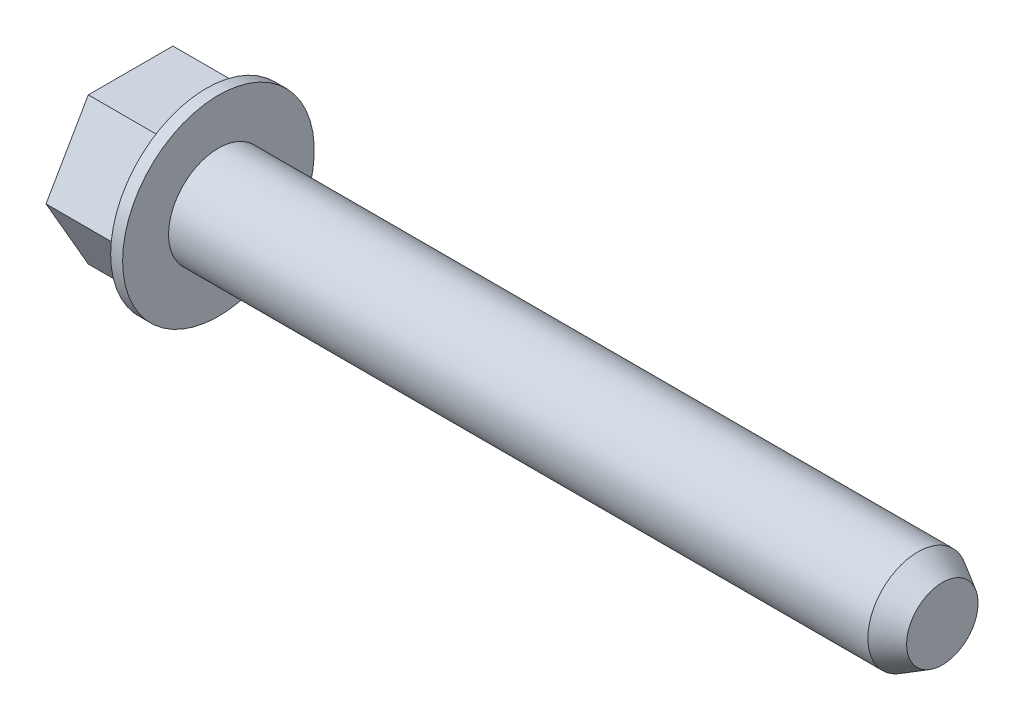
ISO-10303-21;
HEADER;
FILE_DESCRIPTION(('STEP AP214'),'2;1');
FILE_NAME('part.step','',(''),(''),'','','');
FILE_SCHEMA(('AUTOMOTIVE_DESIGN { 1 0 10303 214 1 1 1 1 }'));
ENDSEC;
DATA;
#1=APPLICATION_CONTEXT('core data for automotive mechanical design processes');
#2=APPLICATION_PROTOCOL_DEFINITION('international standard','automotive_design',2000,#1);
#3=PRODUCT_CONTEXT('',#1,'mechanical');
#4=PRODUCT('Part','Part','',(#3));
#5=PRODUCT_RELATED_PRODUCT_CATEGORY('part','',(#4));
#6=PRODUCT_DEFINITION_FORMATION('','',#4);
#7=PRODUCT_DEFINITION_CONTEXT('part definition',#1,'design');
#8=PRODUCT_DEFINITION('design','',#6,#7);
#9=PRODUCT_DEFINITION_SHAPE('','',#8);
#10=(LENGTH_UNIT() NAMED_UNIT(*) SI_UNIT(.MILLI.,.METRE.));
#11=(NAMED_UNIT(*) PLANE_ANGLE_UNIT() SI_UNIT($,.RADIAN.));
#12=(NAMED_UNIT(*) SI_UNIT($,.STERADIAN.) SOLID_ANGLE_UNIT());
#13=UNCERTAINTY_MEASURE_WITH_UNIT(LENGTH_MEASURE(1.E-05),#10,'distance_accuracy_value','');
#14=(GEOMETRIC_REPRESENTATION_CONTEXT(3) GLOBAL_UNCERTAINTY_ASSIGNED_CONTEXT((#13)) GLOBAL_UNIT_ASSIGNED_CONTEXT((#10,
#11,#12)) REPRESENTATION_CONTEXT('',''));
#15=CARTESIAN_POINT('',(0.,0.,0.));
#16=DIRECTION('',(0.,0.,1.));
#17=DIRECTION('',(1.,0.,0.));
#18=AXIS2_PLACEMENT_3D('',#15,#16,#17);
#19=CARTESIAN_POINT('',(0.,0.,0.));
#20=DIRECTION('',(-1.,0.,0.));
#21=DIRECTION('',(0.,0.,1.));
#22=AXIS2_PLACEMENT_3D('',#19,#20,#21);
#23=CYLINDRICAL_SURFACE('',#22,3.175);
#24=CARTESIAN_POINT('',(0.,0.,0.));
#25=DIRECTION('',(-1.,0.,0.));
#26=DIRECTION('',(0.,0.,1.));
#27=AXIS2_PLACEMENT_3D('',#24,#25,#26);
#28=CIRCLE('',#27,3.175);
#29=CARTESIAN_POINT('',(0.,0.,3.175));
#30=VERTEX_POINT('',#29);
#31=EDGE_CURVE('E81',#30,#30,#28,.T.);
#32=ORIENTED_EDGE('',*,*,#31,.F.);
#33=EDGE_LOOP('',(#32));
#34=FACE_BOUND('',#33,.T.);
#35=CARTESIAN_POINT('',(44.4884097868151,0.,0.));
#36=DIRECTION('',(-1.,0.,0.));
#37=DIRECTION('',(0.,0.,1.));
#38=AXIS2_PLACEMENT_3D('',#35,#36,#37);
#39=CIRCLE('',#38,3.175);
#40=CARTESIAN_POINT('',(44.4884097868151,0.,3.175));
#41=VERTEX_POINT('',#40);
#42=EDGE_CURVE('E187',#41,#41,#39,.T.);
#43=ORIENTED_EDGE('',*,*,#42,.T.);
#44=EDGE_LOOP('',(#43));
#45=FACE_BOUND('',#44,.T.);
#46=ADVANCED_FACE('F108',(#34,#45),#23,.T.);
#47=CARTESIAN_POINT('',(-4.6228,3.72872,0.));
#48=DIRECTION('',(1.,0.,0.));
#49=DIRECTION('',(0.,0.,-1.));
#50=AXIS2_PLACEMENT_3D('',#47,#48,#49);
#51=PLANE('',#50);
#52=CARTESIAN_POINT('',(-4.6228,0.,0.));
#53=DIRECTION('',(-1.,0.,0.));
#54=DIRECTION('',(0.,0.,1.));
#55=AXIS2_PLACEMENT_3D('',#52,#53,#54);
#56=CIRCLE('',#55,3.72872);
#57=CARTESIAN_POINT('',(-4.6228,0.,3.72872));
#58=VERTEX_POINT('',#57);
#59=EDGE_CURVE('E219',#58,#58,#56,.T.);
#60=ORIENTED_EDGE('',*,*,#59,.T.);
#61=EDGE_LOOP('',(#60));
#62=FACE_BOUND('',#61,.T.);
#63=ADVANCED_FACE('F110',(#62),#51,.F.);
#64=CARTESIAN_POINT('',(0.,3.175,0.));
#65=DIRECTION('',(-1.,0.,0.));
#66=DIRECTION('',(0.,0.,1.));
#67=AXIS2_PLACEMENT_3D('',#64,#65,#66);
#68=PLANE('',#67);
#69=CARTESIAN_POINT('',(0.,0.,0.));
#70=DIRECTION('',(-1.,0.,0.));
#71=DIRECTION('',(0.,0.,1.));
#72=AXIS2_PLACEMENT_3D('',#69,#70,#71);
#73=CIRCLE('',#72,6.096);
#74=CARTESIAN_POINT('',(0.,0.,6.096));
#75=VERTEX_POINT('',#74);
#76=EDGE_CURVE('E116',#75,#75,#73,.T.);
#77=ORIENTED_EDGE('',*,*,#76,.F.);
#78=EDGE_LOOP('',(#77));
#79=FACE_BOUND('',#78,.T.);
#80=ORIENTED_EDGE('',*,*,#31,.T.);
#81=EDGE_LOOP('',(#80));
#82=FACE_BOUND('',#81,.T.);
#83=ADVANCED_FACE('F233',(#79,#82),#68,.F.);
#84=CARTESIAN_POINT('',(0.,0.,0.));
#85=DIRECTION('',(-1.,0.,0.));
#86=DIRECTION('',(0.,0.,1.));
#87=AXIS2_PLACEMENT_3D('',#84,#85,#86);
#88=CYLINDRICAL_SURFACE('',#87,6.096);
#89=CARTESIAN_POINT('',(-0.762,0.,0.));
#90=DIRECTION('',(-1.,0.,0.));
#91=DIRECTION('',(0.,0.,1.));
#92=AXIS2_PLACEMENT_3D('',#89,#90,#91);
#93=CIRCLE('',#92,6.096);
#94=CARTESIAN_POINT('',(-0.762,0.,6.096));
#95=VERTEX_POINT('',#94);
#96=EDGE_CURVE('E226',#95,#95,#93,.T.);
#97=ORIENTED_EDGE('',*,*,#96,.F.);
#98=EDGE_LOOP('',(#97));
#99=FACE_BOUND('',#98,.T.);
#100=ORIENTED_EDGE('',*,*,#76,.T.);
#101=EDGE_LOOP('',(#100));
#102=FACE_BOUND('',#101,.T.);
#103=ADVANCED_FACE('F231',(#99,#102),#88,.T.);
#104=CARTESIAN_POINT('',(-0.762,6.096,0.));
#105=DIRECTION('',(1.,0.,0.));
#106=DIRECTION('',(0.,0.,-1.));
#107=AXIS2_PLACEMENT_3D('',#104,#105,#106);
#108=PLANE('',#107);
#109=DIRECTION('',(0.,0.,1.));
#110=VECTOR('',#109,1.);
#111=CARTESIAN_POINT('',(-0.762000000008811,-4.6609,0.));
#112=LINE('',#111,#110);
#113=CARTESIAN_POINT('',(-0.762,-4.6609,-2.69097186966593));
#114=VERTEX_POINT('',#113);
#115=CARTESIAN_POINT('',(-0.762,-4.6609,2.69097186966593));
#116=VERTEX_POINT('',#115);
#117=EDGE_CURVE('E182',#114,#116,#112,.T.);
#118=ORIENTED_EDGE('',*,*,#117,.F.);
#119=DIRECTION('',(0.,-0.866025403784439,0.5));
#120=VECTOR('',#119,1.);
#121=CARTESIAN_POINT('',(-0.762000000008811,-2.33045,-4.03645780449889));
#122=LINE('',#121,#120);
#123=CARTESIAN_POINT('',(-0.761999999895124,0.,-5.38194373933185));
#124=VERTEX_POINT('',#123);
#125=EDGE_CURVE('E123',#124,#114,#122,.T.);
#126=ORIENTED_EDGE('',*,*,#125,.F.);
#127=DIRECTION('',(0.,-0.866025403784439,-0.5));
#128=VECTOR('',#127,1.);
#129=CARTESIAN_POINT('',(-0.762000000008811,2.33045,-4.03645780449889));
#130=LINE('',#129,#128);
#131=CARTESIAN_POINT('',(-0.762,4.6609,-2.69097186966593));
#132=VERTEX_POINT('',#131);
#133=EDGE_CURVE('E213',#132,#124,#130,.T.);
#134=ORIENTED_EDGE('',*,*,#133,.F.);
#135=DIRECTION('',(0.,0.,-1.));
#136=VECTOR('',#135,1.);
#137=CARTESIAN_POINT('',(-0.762000000008811,4.6609,0.));
#138=LINE('',#137,#136);
#139=CARTESIAN_POINT('',(-0.762,4.6609,2.69097186966593));
#140=VERTEX_POINT('',#139);
#141=EDGE_CURVE('E205',#140,#132,#138,.T.);
#142=ORIENTED_EDGE('',*,*,#141,.F.);
#143=DIRECTION('',(0.,0.866025403784439,-0.5));
#144=VECTOR('',#143,1.);
#145=CARTESIAN_POINT('',(-0.762000000008811,2.33045,4.03645780449889));
#146=LINE('',#145,#144);
#147=CARTESIAN_POINT('',(-0.762,0.,5.38194373933185));
#148=VERTEX_POINT('',#147);
#149=EDGE_CURVE('E197',#148,#140,#146,.T.);
#150=ORIENTED_EDGE('',*,*,#149,.F.);
#151=DIRECTION('',(0.,0.866025403784439,0.5));
#152=VECTOR('',#151,1.);
#153=CARTESIAN_POINT('',(-0.762000000008811,-2.33045,4.03645780449889));
#154=LINE('',#153,#152);
#155=EDGE_CURVE('E130',#116,#148,#154,.T.);
#156=ORIENTED_EDGE('',*,*,#155,.F.);
#157=EDGE_LOOP('',(#118,#126,#134,#142,#150,#156));
#158=FACE_BOUND('',#157,.T.);
#159=ORIENTED_EDGE('',*,*,#96,.T.);
#160=EDGE_LOOP('',(#159));
#161=FACE_BOUND('',#160,.T.);
#162=ADVANCED_FACE('F281',(#158,#161),#108,.F.);
#163=CARTESIAN_POINT('',(-5.588,4.6609,0.));
#164=DIRECTION('',(1.,0.,0.));
#165=DIRECTION('',(0.,0.,-1.));
#166=AXIS2_PLACEMENT_3D('',#163,#164,#165);
#167=PLANE('',#166);
#168=CARTESIAN_POINT('',(-5.588,0.,0.));
#169=DIRECTION('',(-1.,0.,0.));
#170=DIRECTION('',(0.,0.,1.));
#171=AXIS2_PLACEMENT_3D('',#168,#169,#170);
#172=CIRCLE('',#171,3.72872);
#173=CARTESIAN_POINT('',(-5.588,0.,3.72872));
#174=VERTEX_POINT('',#173);
#175=EDGE_CURVE('E223',#174,#174,#172,.T.);
#176=ORIENTED_EDGE('',*,*,#175,.F.);
#177=EDGE_LOOP('',(#176));
#178=FACE_BOUND('',#177,.T.);
#179=DIRECTION('',(0.,-0.866025403784439,0.5));
#180=VECTOR('',#179,1.);
#181=CARTESIAN_POINT('',(-5.588,-2.33045,-4.03645780449889));
#182=LINE('',#181,#180);
#183=CARTESIAN_POINT('',(-5.588,0.,-5.38194373933185));
#184=VERTEX_POINT('',#183);
#185=CARTESIAN_POINT('',(-5.588,-4.6609,-2.69097186966593));
#186=VERTEX_POINT('',#185);
#187=EDGE_CURVE('E164',#184,#186,#182,.T.);
#188=ORIENTED_EDGE('',*,*,#187,.T.);
#189=DIRECTION('',(0.,0.,1.));
#190=VECTOR('',#189,1.);
#191=CARTESIAN_POINT('',(-5.588,-4.6609,0.));
#192=LINE('',#191,#190);
#193=CARTESIAN_POINT('',(-5.588,-4.6609,2.69097186966593));
#194=VERTEX_POINT('',#193);
#195=EDGE_CURVE('E168',#186,#194,#192,.T.);
#196=ORIENTED_EDGE('',*,*,#195,.T.);
#197=DIRECTION('',(0.,0.866025403784439,0.5));
#198=VECTOR('',#197,1.);
#199=CARTESIAN_POINT('',(-5.588,-2.33045,4.03645780449889));
#200=LINE('',#199,#198);
#201=CARTESIAN_POINT('',(-5.588,0.,5.38194373933185));
#202=VERTEX_POINT('',#201);
#203=EDGE_CURVE('E195',#194,#202,#200,.T.);
#204=ORIENTED_EDGE('',*,*,#203,.T.);
#205=DIRECTION('',(0.,0.866025403784439,-0.5));
#206=VECTOR('',#205,1.);
#207=CARTESIAN_POINT('',(-5.588,2.33045,4.03645780449889));
#208=LINE('',#207,#206);
#209=CARTESIAN_POINT('',(-5.588,4.6609,2.69097186966593));
#210=VERTEX_POINT('',#209);
#211=EDGE_CURVE('E202',#202,#210,#208,.T.);
#212=ORIENTED_EDGE('',*,*,#211,.T.);
#213=DIRECTION('',(0.,0.,-1.));
#214=VECTOR('',#213,1.);
#215=CARTESIAN_POINT('',(-5.588,4.6609,0.));
#216=LINE('',#215,#214);
#217=CARTESIAN_POINT('',(-5.588,4.6609,-2.69097186966593));
#218=VERTEX_POINT('',#217);
#219=EDGE_CURVE('E211',#210,#218,#216,.T.);
#220=ORIENTED_EDGE('',*,*,#219,.T.);
#221=DIRECTION('',(0.,-0.866025403784439,-0.5));
#222=VECTOR('',#221,1.);
#223=CARTESIAN_POINT('',(-5.588,2.33045,-4.03645780449889));
#224=LINE('',#223,#222);
#225=EDGE_CURVE('E170',#218,#184,#224,.T.);
#226=ORIENTED_EDGE('',*,*,#225,.T.);
#227=EDGE_LOOP('',(#188,#196,#204,#212,#220,#226));
#228=FACE_BOUND('',#227,.T.);
#229=ADVANCED_FACE('F166',(#178,#228),#167,.F.);
#230=CARTESIAN_POINT('',(0.,0.,0.));
#231=DIRECTION('',(-1.,0.,0.));
#232=DIRECTION('',(0.,0.,1.));
#233=AXIS2_PLACEMENT_3D('',#230,#231,#232);
#234=CYLINDRICAL_SURFACE('',#233,3.72872);
#235=ORIENTED_EDGE('',*,*,#59,.F.);
#236=EDGE_LOOP('',(#235));
#237=FACE_BOUND('',#236,.T.);
#238=ORIENTED_EDGE('',*,*,#175,.T.);
#239=EDGE_LOOP('',(#238));
#240=FACE_BOUND('',#239,.T.);
#241=ADVANCED_FACE('F272',(#237,#240),#234,.F.);
#242=CARTESIAN_POINT('',(500000.,-2.33045,-4.03645780449889));
#243=DIRECTION('',(0.,-0.5,-0.866025403784439));
#244=DIRECTION('',(0.,0.866025403784439,-0.5));
#245=AXIS2_PLACEMENT_3D('',#242,#243,#244);
#246=PLANE('',#245);
#247=DIRECTION('',(-1.,0.,0.));
#248=VECTOR('',#247,1.);
#249=CARTESIAN_POINT('',(500000.,0.,-5.38194373933185));
#250=LINE('',#249,#248);
#251=EDGE_CURVE('E171',#124,#184,#250,.T.);
#252=ORIENTED_EDGE('',*,*,#251,.F.);
#253=ORIENTED_EDGE('',*,*,#125,.T.);
#254=DIRECTION('',(-1.,0.,0.));
#255=VECTOR('',#254,1.);
#256=CARTESIAN_POINT('',(500000.,-4.6609,-2.69097186966593));
#257=LINE('',#256,#255);
#258=EDGE_CURVE('E177',#114,#186,#257,.T.);
#259=ORIENTED_EDGE('',*,*,#258,.T.);
#260=ORIENTED_EDGE('',*,*,#187,.F.);
#261=EDGE_LOOP('',(#252,#253,#259,#260));
#262=FACE_BOUND('',#261,.T.);
#263=ADVANCED_FACE('F181',(#262),#246,.T.);
#264=CARTESIAN_POINT('',(500000.,2.33045,-4.03645780449889));
#265=DIRECTION('',(0.,0.5,-0.866025403784439));
#266=DIRECTION('',(0.,0.866025403784439,0.5));
#267=AXIS2_PLACEMENT_3D('',#264,#265,#266);
#268=PLANE('',#267);
#269=ORIENTED_EDGE('',*,*,#225,.F.);
#270=DIRECTION('',(-1.,0.,0.));
#271=VECTOR('',#270,1.);
#272=CARTESIAN_POINT('',(500000.,4.6609,-2.69097186966593));
#273=LINE('',#272,#271);
#274=EDGE_CURVE('E208',#132,#218,#273,.T.);
#275=ORIENTED_EDGE('',*,*,#274,.F.);
#276=ORIENTED_EDGE('',*,*,#133,.T.);
#277=ORIENTED_EDGE('',*,*,#251,.T.);
#278=EDGE_LOOP('',(#269,#275,#276,#277));
#279=FACE_BOUND('',#278,.T.);
#280=ADVANCED_FACE('F268',(#279),#268,.T.);
#281=CARTESIAN_POINT('',(500000.,4.6609,0.));
#282=DIRECTION('',(0.,1.,0.));
#283=DIRECTION('',(0.,0.,1.));
#284=AXIS2_PLACEMENT_3D('',#281,#282,#283);
#285=PLANE('',#284);
#286=ORIENTED_EDGE('',*,*,#219,.F.);
#287=DIRECTION('',(-1.,0.,0.));
#288=VECTOR('',#287,1.);
#289=CARTESIAN_POINT('',(500000.,4.6609,2.69097186966593));
#290=LINE('',#289,#288);
#291=EDGE_CURVE('E199',#140,#210,#290,.T.);
#292=ORIENTED_EDGE('',*,*,#291,.F.);
#293=ORIENTED_EDGE('',*,*,#141,.T.);
#294=ORIENTED_EDGE('',*,*,#274,.T.);
#295=EDGE_LOOP('',(#286,#292,#293,#294));
#296=FACE_BOUND('',#295,.T.);
#297=ADVANCED_FACE('F264',(#296),#285,.T.);
#298=CARTESIAN_POINT('',(500000.,2.33045,4.03645780449889));
#299=DIRECTION('',(0.,0.5,0.866025403784439));
#300=DIRECTION('',(0.,-0.866025403784439,0.5));
#301=AXIS2_PLACEMENT_3D('',#298,#299,#300);
#302=PLANE('',#301);
#303=ORIENTED_EDGE('',*,*,#211,.F.);
#304=DIRECTION('',(-1.,0.,0.));
#305=VECTOR('',#304,1.);
#306=CARTESIAN_POINT('',(500000.,0.,5.38194373933185));
#307=LINE('',#306,#305);
#308=EDGE_CURVE('E192',#148,#202,#307,.T.);
#309=ORIENTED_EDGE('',*,*,#308,.F.);
#310=ORIENTED_EDGE('',*,*,#149,.T.);
#311=ORIENTED_EDGE('',*,*,#291,.T.);
#312=EDGE_LOOP('',(#303,#309,#310,#311));
#313=FACE_BOUND('',#312,.T.);
#314=ADVANCED_FACE('F260',(#313),#302,.T.);
#315=CARTESIAN_POINT('',(500000.,-2.33045,4.03645780449889));
#316=DIRECTION('',(0.,-0.5,0.866025403784439));
#317=DIRECTION('',(0.,-0.866025403784439,-0.5));
#318=AXIS2_PLACEMENT_3D('',#315,#316,#317);
#319=PLANE('',#318);
#320=ORIENTED_EDGE('',*,*,#203,.F.);
#321=DIRECTION('',(-1.,0.,0.));
#322=VECTOR('',#321,1.);
#323=CARTESIAN_POINT('',(500000.,-4.6609,2.69097186966593));
#324=LINE('',#323,#322);
#325=EDGE_CURVE('E179',#116,#194,#324,.T.);
#326=ORIENTED_EDGE('',*,*,#325,.F.);
#327=ORIENTED_EDGE('',*,*,#155,.T.);
#328=ORIENTED_EDGE('',*,*,#308,.T.);
#329=EDGE_LOOP('',(#320,#326,#327,#328));
#330=FACE_BOUND('',#329,.T.);
#331=ADVANCED_FACE('F255',(#330),#319,.T.);
#332=CARTESIAN_POINT('',(500000.,-4.6609,0.));
#333=DIRECTION('',(0.,-1.,0.));
#334=DIRECTION('',(0.,0.,-1.));
#335=AXIS2_PLACEMENT_3D('',#332,#333,#334);
#336=PLANE('',#335);
#337=ORIENTED_EDGE('',*,*,#195,.F.);
#338=ORIENTED_EDGE('',*,*,#258,.F.);
#339=ORIENTED_EDGE('',*,*,#117,.T.);
#340=ORIENTED_EDGE('',*,*,#325,.T.);
#341=EDGE_LOOP('',(#337,#338,#339,#340));
#342=FACE_BOUND('',#341,.T.);
#343=ADVANCED_FACE('F176',(#342),#336,.T.);
#344=CARTESIAN_POINT('',(44.4884097868151,0.,0.));
#345=DIRECTION('',(-1.,0.,0.));
#346=DIRECTION('',(0.,0.,1.));
#347=AXIS2_PLACEMENT_3D('',#344,#345,#346);
#348=CONICAL_SURFACE('',#347,3.175,0.523598775598292);
#349=CARTESIAN_POINT('',(46.0502,0.,0.));
#350=DIRECTION('',(-1.,0.,0.));
#351=DIRECTION('',(0.,0.,1.));
#352=AXIS2_PLACEMENT_3D('',#349,#350,#351);
#353=CIRCLE('',#352,2.2733);
#354=CARTESIAN_POINT('',(46.0502,0.,2.2733));
#355=VERTEX_POINT('',#354);
#356=EDGE_CURVE('E183',#355,#355,#353,.T.);
#357=ORIENTED_EDGE('',*,*,#356,.T.);
#358=EDGE_LOOP('',(#357));
#359=FACE_BOUND('',#358,.T.);
#360=ORIENTED_EDGE('',*,*,#42,.F.);
#361=EDGE_LOOP('',(#360));
#362=FACE_BOUND('',#361,.T.);
#363=ADVANCED_FACE('F245',(#359,#362),#348,.T.);
#364=CARTESIAN_POINT('',(46.0502,3.175,0.));
#365=DIRECTION('',(-1.,0.,0.));
#366=DIRECTION('',(0.,0.,1.));
#367=AXIS2_PLACEMENT_3D('',#364,#365,#366);
#368=PLANE('',#367);
#369=ORIENTED_EDGE('',*,*,#356,.F.);
#370=EDGE_LOOP('',(#369));
#371=FACE_BOUND('',#370,.T.);
#372=ADVANCED_FACE('F247',(#371),#368,.F.);
#373=CLOSED_SHELL('',(#46,#63,#83,#103,#162,#229,#241,#263,#280,#297,#314,#331,#343,#363,#372));
#374=MANIFOLD_SOLID_BREP('B7',#373);
#375=ADVANCED_BREP_SHAPE_REPRESENTATION('',(#18,#374),#14);
#376=SHAPE_DEFINITION_REPRESENTATION(#9,#375);
ENDSEC;
END-ISO-10303-21;
